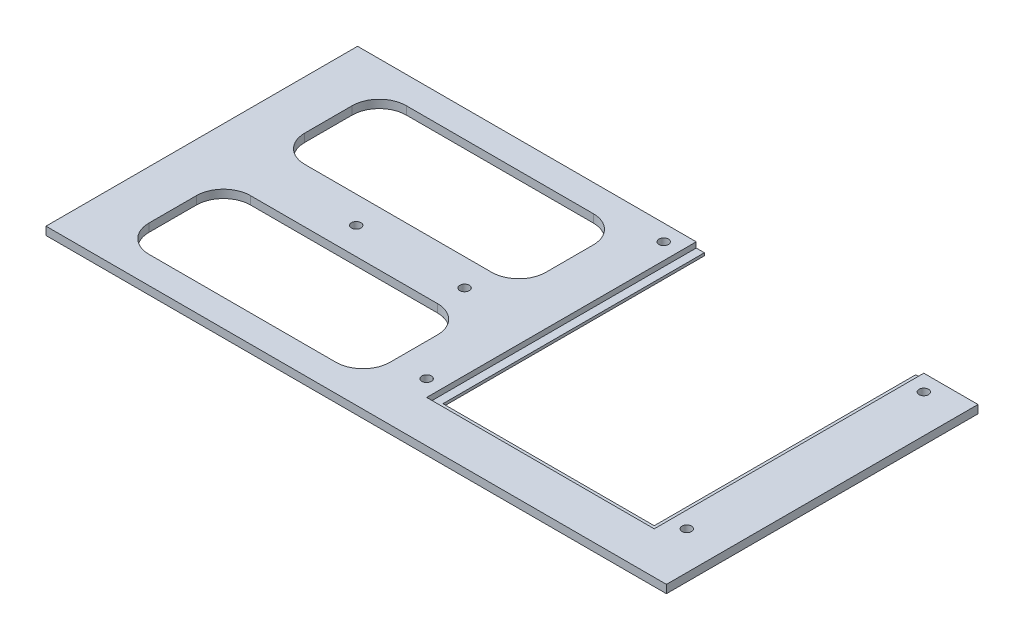
ISO-10303-21;
HEADER;
FILE_DESCRIPTION(('STEP AP214'),'2;1');
FILE_NAME('part.step','',(''),(''),'','','');
FILE_SCHEMA(('AUTOMOTIVE_DESIGN { 1 0 10303 214 1 1 1 1 }'));
ENDSEC;
DATA;
#1=APPLICATION_CONTEXT('core data for automotive mechanical design processes');
#2=APPLICATION_PROTOCOL_DEFINITION('international standard','automotive_design',2000,#1);
#3=PRODUCT_CONTEXT('',#1,'mechanical');
#4=PRODUCT('Part','Part','',(#3));
#5=PRODUCT_RELATED_PRODUCT_CATEGORY('part','',(#4));
#6=PRODUCT_DEFINITION_FORMATION('','',#4);
#7=PRODUCT_DEFINITION_CONTEXT('part definition',#1,'design');
#8=PRODUCT_DEFINITION('design','',#6,#7);
#9=PRODUCT_DEFINITION_SHAPE('','',#8);
#10=(LENGTH_UNIT() NAMED_UNIT(*) SI_UNIT(.MILLI.,.METRE.));
#11=(NAMED_UNIT(*) PLANE_ANGLE_UNIT() SI_UNIT($,.RADIAN.));
#12=(NAMED_UNIT(*) SI_UNIT($,.STERADIAN.) SOLID_ANGLE_UNIT());
#13=UNCERTAINTY_MEASURE_WITH_UNIT(LENGTH_MEASURE(1.E-05),#10,'distance_accuracy_value','');
#14=(GEOMETRIC_REPRESENTATION_CONTEXT(3) GLOBAL_UNCERTAINTY_ASSIGNED_CONTEXT((#13)) GLOBAL_UNIT_ASSIGNED_CONTEXT((#10,
#11,#12)) REPRESENTATION_CONTEXT('',''));
#15=CARTESIAN_POINT('',(0.,0.,0.));
#16=DIRECTION('',(0.,0.,1.));
#17=DIRECTION('',(1.,0.,0.));
#18=AXIS2_PLACEMENT_3D('',#15,#16,#17);
#19=CARTESIAN_POINT('',(-121.684913217623,3.,-60.5367156208277));
#20=DIRECTION('',(0.,0.,1.));
#21=DIRECTION('',(1.,0.,0.));
#22=AXIS2_PLACEMENT_3D('',#19,#20,#21);
#23=PLANE('',#22);
#24=DIRECTION('',(-1.,0.,0.));
#25=VECTOR('',#24,1.);
#26=CARTESIAN_POINT('',(0.,1.,-60.5367156208277));
#27=LINE('',#26,#25);
#28=CARTESIAN_POINT('',(6.31508678237656,1.,-60.5367156208277));
#29=VERTEX_POINT('',#28);
#30=CARTESIAN_POINT('',(3.31508678237656,1.,-60.5367156208277));
#31=VERTEX_POINT('',#30);
#32=EDGE_CURVE('E480',#29,#31,#27,.T.);
#33=ORIENTED_EDGE('',*,*,#32,.F.);
#34=DIRECTION('',(0.,1.,0.));
#35=VECTOR('',#34,1.);
#36=CARTESIAN_POINT('',(6.31508678237656,-1.,-60.5367156208277));
#37=LINE('',#36,#35);
#38=CARTESIAN_POINT('',(6.31508678237656,0.,-60.5367156208277));
#39=VERTEX_POINT('',#38);
#40=EDGE_CURVE('E445',#39,#29,#37,.T.);
#41=ORIENTED_EDGE('',*,*,#40,.F.);
#42=DIRECTION('',(-1.,0.,0.));
#43=VECTOR('',#42,1.);
#44=CARTESIAN_POINT('',(-121.684913217623,0.,-60.5367156208277));
#45=LINE('',#44,#43);
#46=CARTESIAN_POINT('',(-121.684913217623,0.,-60.5367156208277));
#47=VERTEX_POINT('',#46);
#48=EDGE_CURVE('E538',#39,#47,#45,.T.);
#49=ORIENTED_EDGE('',*,*,#48,.T.);
#50=DIRECTION('',(0.,-1.,0.));
#51=VECTOR('',#50,1.);
#52=CARTESIAN_POINT('',(-121.684913217623,3.,-60.5367156208277));
#53=LINE('',#52,#51);
#54=CARTESIAN_POINT('',(-121.684913217623,3.,-60.5367156208277));
#55=VERTEX_POINT('',#54);
#56=EDGE_CURVE('E528',#55,#47,#53,.T.);
#57=ORIENTED_EDGE('',*,*,#56,.F.);
#58=DIRECTION('',(-1.,0.,0.));
#59=VECTOR('',#58,1.);
#60=CARTESIAN_POINT('',(-121.684913217623,3.,-60.5367156208277));
#61=LINE('',#60,#59);
#62=CARTESIAN_POINT('',(3.31508678237656,3.,-60.5367156208277));
#63=VERTEX_POINT('',#62);
#64=EDGE_CURVE('E523',#63,#55,#61,.T.);
#65=ORIENTED_EDGE('',*,*,#64,.F.);
#66=DIRECTION('',(0.,1.,0.));
#67=VECTOR('',#66,1.);
#68=CARTESIAN_POINT('',(3.31508678237656,1.,-60.5367156208277));
#69=LINE('',#68,#67);
#70=EDGE_CURVE('E502',#31,#63,#69,.T.);
#71=ORIENTED_EDGE('',*,*,#70,.F.);
#72=EDGE_LOOP('',(#33,#41,#49,#57,#65,#71));
#73=FACE_BOUND('',#72,.T.);
#74=ADVANCED_FACE('F39',(#73),#23,.F.);
#75=CARTESIAN_POINT('',(107.315086782377,0.,-60.5367156208277));
#76=VERTEX_POINT('',#75);
#77=CARTESIAN_POINT('',(84.3150867823766,0.,-60.5367156208277));
#78=VERTEX_POINT('',#77);
#79=EDGE_CURVE('E517',#76,#78,#45,.T.);
#80=ORIENTED_EDGE('',*,*,#79,.T.);
#81=DIRECTION('',(0.,1.,0.));
#82=VECTOR('',#81,1.);
#83=CARTESIAN_POINT('',(84.3150867823766,-1.,-60.5367156208277));
#84=LINE('',#83,#82);
#85=CARTESIAN_POINT('',(84.3150867823766,1.,-60.5367156208277));
#86=VERTEX_POINT('',#85);
#87=EDGE_CURVE('E449',#78,#86,#84,.T.);
#88=ORIENTED_EDGE('',*,*,#87,.T.);
#89=CARTESIAN_POINT('',(87.3150867823766,1.,-60.5367156208277));
#90=VERTEX_POINT('',#89);
#91=EDGE_CURVE('E481',#90,#86,#27,.T.);
#92=ORIENTED_EDGE('',*,*,#91,.F.);
#93=DIRECTION('',(0.,1.,0.));
#94=VECTOR('',#93,1.);
#95=CARTESIAN_POINT('',(87.3150867823766,1.,-60.5367156208277));
#96=LINE('',#95,#94);
#97=CARTESIAN_POINT('',(87.3150867823766,3.,-60.5367156208277));
#98=VERTEX_POINT('',#97);
#99=EDGE_CURVE('E505',#90,#98,#96,.T.);
#100=ORIENTED_EDGE('',*,*,#99,.T.);
#101=CARTESIAN_POINT('',(107.315086782377,3.,-60.5367156208277));
#102=VERTEX_POINT('',#101);
#103=EDGE_CURVE('E524',#102,#98,#61,.T.);
#104=ORIENTED_EDGE('',*,*,#103,.F.);
#105=DIRECTION('',(0.,-1.,0.));
#106=VECTOR('',#105,1.);
#107=CARTESIAN_POINT('',(107.315086782377,3.,-60.5367156208277));
#108=LINE('',#107,#106);
#109=EDGE_CURVE('E545',#102,#76,#108,.T.);
#110=ORIENTED_EDGE('',*,*,#109,.T.);
#111=EDGE_LOOP('',(#80,#88,#92,#100,#104,#110));
#112=FACE_BOUND('',#111,.T.);
#113=ADVANCED_FACE('F562',(#112),#23,.F.);
#114=CARTESIAN_POINT('',(0.,3.,0.));
#115=DIRECTION('',(0.,1.,0.));
#116=DIRECTION('',(0.,0.,1.));
#117=AXIS2_PLACEMENT_3D('',#114,#115,#116);
#118=PLANE('',#117);
#119=CARTESIAN_POINT('',(-2.68491321762344,3.,-54.5367156208277));
#120=DIRECTION('',(0.,1.,0.));
#121=DIRECTION('',(0.,0.,1.));
#122=AXIS2_PLACEMENT_3D('',#119,#120,#121);
#123=CIRCLE('',#122,1.75);
#124=CARTESIAN_POINT('',(-2.68491321762344,3.,-52.7867156208277));
#125=VERTEX_POINT('',#124);
#126=EDGE_CURVE('E327',#125,#125,#123,.T.);
#127=ORIENTED_EDGE('',*,*,#126,.F.);
#128=EDGE_LOOP('',(#127));
#129=FACE_BOUND('',#128,.T.);
#130=CARTESIAN_POINT('',(-24.6849132176234,3.,16.9632843791723));
#131=DIRECTION('',(0.,1.,0.));
#132=DIRECTION('',(0.,0.,-1.));
#133=AXIS2_PLACEMENT_3D('',#130,#131,#132);
#134=CIRCLE('',#133,10.);
#135=CARTESIAN_POINT('',(-14.6849132176234,3.,16.9632843791723));
#136=VERTEX_POINT('',#135);
#137=CARTESIAN_POINT('',(-24.6849132176234,3.,6.96328437917233));
#138=VERTEX_POINT('',#137);
#139=EDGE_CURVE('E55',#136,#138,#134,.T.);
#140=ORIENTED_EDGE('',*,*,#139,.F.);
#141=DIRECTION('',(0.,0.,-1.));
#142=VECTOR('',#141,1.);
#143=CARTESIAN_POINT('',(-14.6849132176234,3.,16.9632843791723));
#144=LINE('',#143,#142);
#145=CARTESIAN_POINT('',(-14.6849132176234,3.,34.4632843791723));
#146=VERTEX_POINT('',#145);
#147=EDGE_CURVE('E250',#146,#136,#144,.T.);
#148=ORIENTED_EDGE('',*,*,#147,.F.);
#149=CARTESIAN_POINT('',(-24.6849132176234,3.,34.4632843791723));
#150=DIRECTION('',(0.,1.,0.));
#151=DIRECTION('',(0.,0.,-1.));
#152=AXIS2_PLACEMENT_3D('',#149,#150,#151);
#153=CIRCLE('',#152,10.);
#154=CARTESIAN_POINT('',(-24.6849132176234,3.,44.4632843791723));
#155=VERTEX_POINT('',#154);
#156=EDGE_CURVE('E254',#155,#146,#153,.T.);
#157=ORIENTED_EDGE('',*,*,#156,.F.);
#158=DIRECTION('',(1.,0.,0.));
#159=VECTOR('',#158,1.);
#160=CARTESIAN_POINT('',(-93.6849132176235,3.,44.4632843791723));
#161=LINE('',#160,#159);
#162=CARTESIAN_POINT('',(-93.6849132176235,3.,44.4632843791723));
#163=VERTEX_POINT('',#162);
#164=EDGE_CURVE('E297',#163,#155,#161,.T.);
#165=ORIENTED_EDGE('',*,*,#164,.F.);
#166=CARTESIAN_POINT('',(-93.6849132176235,3.,34.4632843791723));
#167=DIRECTION('',(0.,1.,0.));
#168=DIRECTION('',(0.,0.,-1.));
#169=AXIS2_PLACEMENT_3D('',#166,#167,#168);
#170=CIRCLE('',#169,10.);
#171=CARTESIAN_POINT('',(-103.684913217623,3.,34.4632843791723));
#172=VERTEX_POINT('',#171);
#173=EDGE_CURVE('E293',#172,#163,#170,.T.);
#174=ORIENTED_EDGE('',*,*,#173,.F.);
#175=DIRECTION('',(0.,0.,1.));
#176=VECTOR('',#175,1.);
#177=CARTESIAN_POINT('',(-103.684913217623,3.,16.9632843791723));
#178=LINE('',#177,#176);
#179=CARTESIAN_POINT('',(-103.684913217623,3.,16.9632843791723));
#180=VERTEX_POINT('',#179);
#181=EDGE_CURVE('E289',#180,#172,#178,.T.);
#182=ORIENTED_EDGE('',*,*,#181,.F.);
#183=CARTESIAN_POINT('',(-93.6849132176235,3.,16.9632843791723));
#184=DIRECTION('',(0.,1.,0.));
#185=DIRECTION('',(0.,0.,-1.));
#186=AXIS2_PLACEMENT_3D('',#183,#184,#185);
#187=CIRCLE('',#186,9.99999999999999);
#188=CARTESIAN_POINT('',(-93.6849132176235,3.,6.96328437917233));
#189=VERTEX_POINT('',#188);
#190=EDGE_CURVE('E285',#189,#180,#187,.T.);
#191=ORIENTED_EDGE('',*,*,#190,.F.);
#192=DIRECTION('',(-1.,0.,0.));
#193=VECTOR('',#192,1.);
#194=CARTESIAN_POINT('',(-93.6849132176235,3.,6.96328437917233));
#195=LINE('',#194,#193);
#196=EDGE_CURVE('E281',#138,#189,#195,.T.);
#197=ORIENTED_EDGE('',*,*,#196,.F.);
#198=EDGE_LOOP('',(#140,#148,#157,#165,#174,#182,#191,#197));
#199=FACE_BOUND('',#198,.T.);
#200=CARTESIAN_POINT('',(-24.6849132176234,3.,-40.5367156208277));
#201=DIRECTION('',(0.,1.,0.));
#202=DIRECTION('',(0.,0.,-1.));
#203=AXIS2_PLACEMENT_3D('',#200,#201,#202);
#204=CIRCLE('',#203,10.);
#205=CARTESIAN_POINT('',(-14.6849132176234,3.,-40.5367156208277));
#206=VERTEX_POINT('',#205);
#207=CARTESIAN_POINT('',(-24.6849132176234,3.,-50.5367156208277));
#208=VERTEX_POINT('',#207);
#209=EDGE_CURVE('E63',#206,#208,#204,.T.);
#210=ORIENTED_EDGE('',*,*,#209,.F.);
#211=DIRECTION('',(0.,0.,-1.));
#212=VECTOR('',#211,1.);
#213=CARTESIAN_POINT('',(-14.6849132176234,3.,-40.5367156208277));
#214=LINE('',#213,#212);
#215=CARTESIAN_POINT('',(-14.6849132176234,3.,-23.0367156208277));
#216=VERTEX_POINT('',#215);
#217=EDGE_CURVE('E347',#216,#206,#214,.T.);
#218=ORIENTED_EDGE('',*,*,#217,.F.);
#219=CARTESIAN_POINT('',(-24.6849132176234,3.,-23.0367156208277));
#220=DIRECTION('',(0.,1.,0.));
#221=DIRECTION('',(0.,0.,-1.));
#222=AXIS2_PLACEMENT_3D('',#219,#220,#221);
#223=CIRCLE('',#222,10.);
#224=CARTESIAN_POINT('',(-24.6849132176234,3.,-13.0367156208277));
#225=VERTEX_POINT('',#224);
#226=EDGE_CURVE('E398',#225,#216,#223,.T.);
#227=ORIENTED_EDGE('',*,*,#226,.F.);
#228=DIRECTION('',(1.,0.,0.));
#229=VECTOR('',#228,1.);
#230=CARTESIAN_POINT('',(-93.6849132176235,3.,-13.0367156208277));
#231=LINE('',#230,#229);
#232=CARTESIAN_POINT('',(-93.6849132176235,3.,-13.0367156208277));
#233=VERTEX_POINT('',#232);
#234=EDGE_CURVE('E394',#233,#225,#231,.T.);
#235=ORIENTED_EDGE('',*,*,#234,.F.);
#236=CARTESIAN_POINT('',(-93.6849132176235,3.,-23.0367156208277));
#237=DIRECTION('',(0.,1.,0.));
#238=DIRECTION('',(0.,0.,-1.));
#239=AXIS2_PLACEMENT_3D('',#236,#237,#238);
#240=CIRCLE('',#239,9.99999999999999);
#241=CARTESIAN_POINT('',(-103.684913217623,3.,-23.0367156208277));
#242=VERTEX_POINT('',#241);
#243=EDGE_CURVE('E390',#242,#233,#240,.T.);
#244=ORIENTED_EDGE('',*,*,#243,.F.);
#245=DIRECTION('',(0.,0.,1.));
#246=VECTOR('',#245,1.);
#247=CARTESIAN_POINT('',(-103.684913217623,3.,-40.5367156208277));
#248=LINE('',#247,#246);
#249=CARTESIAN_POINT('',(-103.684913217623,3.,-40.5367156208277));
#250=VERTEX_POINT('',#249);
#251=EDGE_CURVE('E386',#250,#242,#248,.T.);
#252=ORIENTED_EDGE('',*,*,#251,.F.);
#253=CARTESIAN_POINT('',(-93.6849132176235,3.,-40.5367156208277));
#254=DIRECTION('',(0.,1.,0.));
#255=DIRECTION('',(0.,0.,-1.));
#256=AXIS2_PLACEMENT_3D('',#253,#254,#255);
#257=CIRCLE('',#256,10.);
#258=CARTESIAN_POINT('',(-93.6849132176235,3.,-50.5367156208277));
#259=VERTEX_POINT('',#258);
#260=EDGE_CURVE('E382',#259,#250,#257,.T.);
#261=ORIENTED_EDGE('',*,*,#260,.F.);
#262=DIRECTION('',(-1.,0.,0.));
#263=VECTOR('',#262,1.);
#264=CARTESIAN_POINT('',(-93.6849132176235,3.,-50.5367156208277));
#265=LINE('',#264,#263);
#266=EDGE_CURVE('E378',#208,#259,#265,.T.);
#267=ORIENTED_EDGE('',*,*,#266,.F.);
#268=EDGE_LOOP('',(#210,#218,#227,#235,#244,#252,#261,#267));
#269=FACE_BOUND('',#268,.T.);
#270=CARTESIAN_POINT('',(-24.6849132176234,3.,-3.03671562082767));
#271=DIRECTION('',(0.,1.,0.));
#272=DIRECTION('',(0.,0.,1.));
#273=AXIS2_PLACEMENT_3D('',#270,#271,#272);
#274=CIRCLE('',#273,1.75);
#275=CARTESIAN_POINT('',(-24.6849132176234,3.,-1.28671562082767));
#276=VERTEX_POINT('',#275);
#277=EDGE_CURVE('E337',#276,#276,#274,.T.);
#278=ORIENTED_EDGE('',*,*,#277,.F.);
#279=EDGE_LOOP('',(#278));
#280=FACE_BOUND('',#279,.T.);
#281=CARTESIAN_POINT('',(93.3150867823766,3.,-54.5367156208277));
#282=DIRECTION('',(0.,1.,0.));
#283=DIRECTION('',(0.,0.,1.));
#284=AXIS2_PLACEMENT_3D('',#281,#282,#283);
#285=CIRCLE('',#284,1.75);
#286=CARTESIAN_POINT('',(93.3150867823766,3.,-52.7867156208277));
#287=VERTEX_POINT('',#286);
#288=EDGE_CURVE('E927',#287,#287,#285,.T.);
#289=ORIENTED_EDGE('',*,*,#288,.F.);
#290=EDGE_LOOP('',(#289));
#291=FACE_BOUND('',#290,.T.);
#292=CARTESIAN_POINT('',(93.3150867823766,3.,32.9632843791723));
#293=DIRECTION('',(0.,1.,0.));
#294=DIRECTION('',(0.,0.,1.));
#295=AXIS2_PLACEMENT_3D('',#292,#293,#294);
#296=CIRCLE('',#295,1.75);
#297=CARTESIAN_POINT('',(93.3150867823766,3.,34.7132843791723));
#298=VERTEX_POINT('',#297);
#299=EDGE_CURVE('E931',#298,#298,#296,.T.);
#300=ORIENTED_EDGE('',*,*,#299,.F.);
#301=EDGE_LOOP('',(#300));
#302=FACE_BOUND('',#301,.T.);
#303=CARTESIAN_POINT('',(-2.68491321762344,3.,32.9632843791723));
#304=DIRECTION('',(0.,1.,0.));
#305=DIRECTION('',(0.,0.,1.));
#306=AXIS2_PLACEMENT_3D('',#303,#304,#305);
#307=CIRCLE('',#306,1.75);
#308=CARTESIAN_POINT('',(-2.68491321762344,3.,34.7132843791723));
#309=VERTEX_POINT('',#308);
#310=EDGE_CURVE('E257',#309,#309,#307,.T.);
#311=ORIENTED_EDGE('',*,*,#310,.F.);
#312=EDGE_LOOP('',(#311));
#313=FACE_BOUND('',#312,.T.);
#314=CARTESIAN_POINT('',(-64.6849132176235,3.,-3.03671562082767));
#315=DIRECTION('',(0.,1.,0.));
#316=DIRECTION('',(0.,0.,1.));
#317=AXIS2_PLACEMENT_3D('',#314,#315,#316);
#318=CIRCLE('',#317,1.75);
#319=CARTESIAN_POINT('',(-64.6849132176235,3.,-1.28671562082767));
#320=VERTEX_POINT('',#319);
#321=EDGE_CURVE('E336',#320,#320,#318,.T.);
#322=ORIENTED_EDGE('',*,*,#321,.F.);
#323=EDGE_LOOP('',(#322));
#324=FACE_BOUND('',#323,.T.);
#325=DIRECTION('',(1.,0.,0.));
#326=VECTOR('',#325,1.);
#327=CARTESIAN_POINT('',(0.,3.,38.9632843791723));
#328=LINE('',#327,#326);
#329=CARTESIAN_POINT('',(3.31508678237656,3.,38.9632843791723));
#330=VERTEX_POINT('',#329);
#331=CARTESIAN_POINT('',(87.3150867823766,3.,38.9632843791723));
#332=VERTEX_POINT('',#331);
#333=EDGE_CURVE('E470',#330,#332,#328,.T.);
#334=ORIENTED_EDGE('',*,*,#333,.F.);
#335=DIRECTION('',(0.,0.,-1.));
#336=VECTOR('',#335,1.);
#337=CARTESIAN_POINT('',(3.31508678237656,3.,0.));
#338=LINE('',#337,#336);
#339=EDGE_CURVE('E476',#330,#63,#338,.T.);
#340=ORIENTED_EDGE('',*,*,#339,.T.);
#341=ORIENTED_EDGE('',*,*,#64,.T.);
#342=DIRECTION('',(0.,0.,1.));
#343=VECTOR('',#342,1.);
#344=CARTESIAN_POINT('',(-121.684913217623,3.,-60.5367156208277));
#345=LINE('',#344,#343);
#346=CARTESIAN_POINT('',(-121.684913217623,3.,54.4632843791723));
#347=VERTEX_POINT('',#346);
#348=EDGE_CURVE('E512',#55,#347,#345,.T.);
#349=ORIENTED_EDGE('',*,*,#348,.T.);
#350=DIRECTION('',(1.,0.,0.));
#351=VECTOR('',#350,1.);
#352=CARTESIAN_POINT('',(-121.684913217623,3.,54.4632843791723));
#353=LINE('',#352,#351);
#354=CARTESIAN_POINT('',(107.315086782377,3.,54.4632843791723));
#355=VERTEX_POINT('',#354);
#356=EDGE_CURVE('E516',#347,#355,#353,.T.);
#357=ORIENTED_EDGE('',*,*,#356,.T.);
#358=DIRECTION('',(0.,0.,-1.));
#359=VECTOR('',#358,1.);
#360=CARTESIAN_POINT('',(107.315086782377,3.,-60.5367156208277));
#361=LINE('',#360,#359);
#362=EDGE_CURVE('E520',#355,#102,#361,.T.);
#363=ORIENTED_EDGE('',*,*,#362,.T.);
#364=ORIENTED_EDGE('',*,*,#103,.T.);
#365=DIRECTION('',(0.,0.,-1.));
#366=VECTOR('',#365,1.);
#367=CARTESIAN_POINT('',(87.3150867823766,3.,0.));
#368=LINE('',#367,#366);
#369=EDGE_CURVE('E492',#332,#98,#368,.T.);
#370=ORIENTED_EDGE('',*,*,#369,.F.);
#371=EDGE_LOOP('',(#334,#340,#341,#349,#357,#363,#364,#370));
#372=FACE_BOUND('',#371,.T.);
#373=ADVANCED_FACE('F568',(#129,#199,#269,#280,#291,#302,#313,#324,#372),#118,.T.);
#374=CARTESIAN_POINT('',(-121.684913217623,3.,-60.5367156208277));
#375=DIRECTION('',(1.,0.,0.));
#376=DIRECTION('',(0.,0.,-1.));
#377=AXIS2_PLACEMENT_3D('',#374,#375,#376);
#378=PLANE('',#377);
#379=DIRECTION('',(0.,0.,1.));
#380=VECTOR('',#379,1.);
#381=CARTESIAN_POINT('',(-121.684913217623,0.,-60.5367156208277));
#382=LINE('',#381,#380);
#383=CARTESIAN_POINT('',(-121.684913217623,0.,54.4632843791723));
#384=VERTEX_POINT('',#383);
#385=EDGE_CURVE('E501',#47,#384,#382,.T.);
#386=ORIENTED_EDGE('',*,*,#385,.T.);
#387=DIRECTION('',(0.,-1.,0.));
#388=VECTOR('',#387,1.);
#389=CARTESIAN_POINT('',(-121.684913217623,3.,54.4632843791723));
#390=LINE('',#389,#388);
#391=EDGE_CURVE('E11',#347,#384,#390,.T.);
#392=ORIENTED_EDGE('',*,*,#391,.F.);
#393=ORIENTED_EDGE('',*,*,#348,.F.);
#394=ORIENTED_EDGE('',*,*,#56,.T.);
#395=EDGE_LOOP('',(#386,#392,#393,#394));
#396=FACE_BOUND('',#395,.T.);
#397=ADVANCED_FACE('F41',(#396),#378,.F.);
#398=CARTESIAN_POINT('',(-121.684913217623,3.,54.4632843791723));
#399=DIRECTION('',(0.,0.,-1.));
#400=DIRECTION('',(-1.,0.,0.));
#401=AXIS2_PLACEMENT_3D('',#398,#399,#400);
#402=PLANE('',#401);
#403=DIRECTION('',(1.,0.,0.));
#404=VECTOR('',#403,1.);
#405=CARTESIAN_POINT('',(-121.684913217623,0.,54.4632843791723));
#406=LINE('',#405,#404);
#407=CARTESIAN_POINT('',(107.315086782377,0.,54.4632843791723));
#408=VERTEX_POINT('',#407);
#409=EDGE_CURVE('E532',#384,#408,#406,.T.);
#410=ORIENTED_EDGE('',*,*,#409,.T.);
#411=DIRECTION('',(0.,-1.,0.));
#412=VECTOR('',#411,1.);
#413=CARTESIAN_POINT('',(107.315086782377,3.,54.4632843791723));
#414=LINE('',#413,#412);
#415=EDGE_CURVE('E48',#355,#408,#414,.T.);
#416=ORIENTED_EDGE('',*,*,#415,.F.);
#417=ORIENTED_EDGE('',*,*,#356,.F.);
#418=ORIENTED_EDGE('',*,*,#391,.T.);
#419=EDGE_LOOP('',(#410,#416,#417,#418));
#420=FACE_BOUND('',#419,.T.);
#421=ADVANCED_FACE('F571',(#420),#402,.F.);
#422=CARTESIAN_POINT('',(107.315086782377,3.,-60.5367156208277));
#423=DIRECTION('',(-1.,0.,0.));
#424=DIRECTION('',(0.,0.,1.));
#425=AXIS2_PLACEMENT_3D('',#422,#423,#424);
#426=PLANE('',#425);
#427=DIRECTION('',(0.,0.,-1.));
#428=VECTOR('',#427,1.);
#429=CARTESIAN_POINT('',(107.315086782377,0.,-60.5367156208277));
#430=LINE('',#429,#428);
#431=EDGE_CURVE('E535',#408,#76,#430,.T.);
#432=ORIENTED_EDGE('',*,*,#431,.T.);
#433=ORIENTED_EDGE('',*,*,#109,.F.);
#434=ORIENTED_EDGE('',*,*,#362,.F.);
#435=ORIENTED_EDGE('',*,*,#415,.T.);
#436=EDGE_LOOP('',(#432,#433,#434,#435));
#437=FACE_BOUND('',#436,.T.);
#438=ADVANCED_FACE('F554',(#437),#426,.F.);
#439=CARTESIAN_POINT('',(0.,0.,0.));
#440=DIRECTION('',(0.,1.,0.));
#441=DIRECTION('',(0.,0.,1.));
#442=AXIS2_PLACEMENT_3D('',#439,#440,#441);
#443=PLANE('',#442);
#444=CARTESIAN_POINT('',(-2.68491321762344,0.,-54.5367156208277));
#445=DIRECTION('',(0.,1.,0.));
#446=DIRECTION('',(0.,0.,1.));
#447=AXIS2_PLACEMENT_3D('',#444,#445,#446);
#448=CIRCLE('',#447,1.75);
#449=CARTESIAN_POINT('',(-2.68491321762344,0.,-52.7867156208277));
#450=VERTEX_POINT('',#449);
#451=EDGE_CURVE('E282',#450,#450,#448,.T.);
#452=ORIENTED_EDGE('',*,*,#451,.T.);
#453=EDGE_LOOP('',(#452));
#454=FACE_BOUND('',#453,.T.);
#455=DIRECTION('',(0.,0.,-1.));
#456=VECTOR('',#455,1.);
#457=CARTESIAN_POINT('',(-14.6849132176234,0.,16.9632843791723));
#458=LINE('',#457,#456);
#459=CARTESIAN_POINT('',(-14.6849132176234,0.,34.4632843791723));
#460=VERTEX_POINT('',#459);
#461=CARTESIAN_POINT('',(-14.6849132176234,0.,16.9632843791723));
#462=VERTEX_POINT('',#461);
#463=EDGE_CURVE('E234',#460,#462,#458,.T.);
#464=ORIENTED_EDGE('',*,*,#463,.T.);
#465=CARTESIAN_POINT('',(-24.6849132176234,0.,16.9632843791723));
#466=DIRECTION('',(0.,1.,0.));
#467=DIRECTION('',(0.,0.,-1.));
#468=AXIS2_PLACEMENT_3D('',#465,#466,#467);
#469=CIRCLE('',#468,10.);
#470=CARTESIAN_POINT('',(-24.6849132176234,0.,6.96328437917233));
#471=VERTEX_POINT('',#470);
#472=EDGE_CURVE('E227',#462,#471,#469,.T.);
#473=ORIENTED_EDGE('',*,*,#472,.T.);
#474=DIRECTION('',(-1.,0.,0.));
#475=VECTOR('',#474,1.);
#476=CARTESIAN_POINT('',(-93.6849132176235,0.,6.96328437917233));
#477=LINE('',#476,#475);
#478=CARTESIAN_POINT('',(-93.6849132176235,0.,6.96328437917233));
#479=VERTEX_POINT('',#478);
#480=EDGE_CURVE('E238',#471,#479,#477,.T.);
#481=ORIENTED_EDGE('',*,*,#480,.T.);
#482=CARTESIAN_POINT('',(-93.6849132176235,0.,16.9632843791723));
#483=DIRECTION('',(0.,1.,0.));
#484=DIRECTION('',(0.,0.,-1.));
#485=AXIS2_PLACEMENT_3D('',#482,#483,#484);
#486=CIRCLE('',#485,9.99999999999999);
#487=CARTESIAN_POINT('',(-103.684913217623,0.,16.9632843791723));
#488=VERTEX_POINT('',#487);
#489=EDGE_CURVE('E243',#479,#488,#486,.T.);
#490=ORIENTED_EDGE('',*,*,#489,.T.);
#491=DIRECTION('',(0.,0.,1.));
#492=VECTOR('',#491,1.);
#493=CARTESIAN_POINT('',(-103.684913217623,0.,16.9632843791723));
#494=LINE('',#493,#492);
#495=CARTESIAN_POINT('',(-103.684913217623,0.,34.4632843791723));
#496=VERTEX_POINT('',#495);
#497=EDGE_CURVE('E262',#488,#496,#494,.T.);
#498=ORIENTED_EDGE('',*,*,#497,.T.);
#499=CARTESIAN_POINT('',(-93.6849132176235,0.,34.4632843791723));
#500=DIRECTION('',(0.,1.,0.));
#501=DIRECTION('',(0.,0.,-1.));
#502=AXIS2_PLACEMENT_3D('',#499,#500,#501);
#503=CIRCLE('',#502,10.);
#504=CARTESIAN_POINT('',(-93.6849132176235,0.,44.4632843791723));
#505=VERTEX_POINT('',#504);
#506=EDGE_CURVE('E266',#496,#505,#503,.T.);
#507=ORIENTED_EDGE('',*,*,#506,.T.);
#508=DIRECTION('',(1.,0.,0.));
#509=VECTOR('',#508,1.);
#510=CARTESIAN_POINT('',(-93.6849132176235,0.,44.4632843791723));
#511=LINE('',#510,#509);
#512=CARTESIAN_POINT('',(-24.6849132176234,0.,44.4632843791723));
#513=VERTEX_POINT('',#512);
#514=EDGE_CURVE('E270',#505,#513,#511,.T.);
#515=ORIENTED_EDGE('',*,*,#514,.T.);
#516=CARTESIAN_POINT('',(-24.6849132176234,0.,34.4632843791723));
#517=DIRECTION('',(0.,1.,0.));
#518=DIRECTION('',(0.,0.,-1.));
#519=AXIS2_PLACEMENT_3D('',#516,#517,#518);
#520=CIRCLE('',#519,10.);
#521=EDGE_CURVE('E274',#513,#460,#520,.T.);
#522=ORIENTED_EDGE('',*,*,#521,.T.);
#523=EDGE_LOOP('',(#464,#473,#481,#490,#498,#507,#515,#522));
#524=FACE_BOUND('',#523,.T.);
#525=DIRECTION('',(0.,0.,-1.));
#526=VECTOR('',#525,1.);
#527=CARTESIAN_POINT('',(-14.6849132176234,0.,-40.5367156208277));
#528=LINE('',#527,#526);
#529=CARTESIAN_POINT('',(-14.6849132176234,0.,-23.0367156208277));
#530=VERTEX_POINT('',#529);
#531=CARTESIAN_POINT('',(-14.6849132176234,0.,-40.5367156208277));
#532=VERTEX_POINT('',#531);
#533=EDGE_CURVE('E371',#530,#532,#528,.T.);
#534=ORIENTED_EDGE('',*,*,#533,.T.);
#535=CARTESIAN_POINT('',(-24.6849132176234,0.,-40.5367156208277));
#536=DIRECTION('',(0.,1.,0.));
#537=DIRECTION('',(0.,0.,-1.));
#538=AXIS2_PLACEMENT_3D('',#535,#536,#537);
#539=CIRCLE('',#538,10.);
#540=CARTESIAN_POINT('',(-24.6849132176234,0.,-50.5367156208277));
#541=VERTEX_POINT('',#540);
#542=EDGE_CURVE('E342',#532,#541,#539,.T.);
#543=ORIENTED_EDGE('',*,*,#542,.T.);
#544=DIRECTION('',(-1.,0.,0.));
#545=VECTOR('',#544,1.);
#546=CARTESIAN_POINT('',(-93.6849132176235,0.,-50.5367156208277));
#547=LINE('',#546,#545);
#548=CARTESIAN_POINT('',(-93.6849132176235,0.,-50.5367156208277));
#549=VERTEX_POINT('',#548);
#550=EDGE_CURVE('E346',#541,#549,#547,.T.);
#551=ORIENTED_EDGE('',*,*,#550,.T.);
#552=CARTESIAN_POINT('',(-93.6849132176235,0.,-40.5367156208277));
#553=DIRECTION('',(0.,1.,0.));
#554=DIRECTION('',(0.,0.,-1.));
#555=AXIS2_PLACEMENT_3D('',#552,#553,#554);
#556=CIRCLE('',#555,10.);
#557=CARTESIAN_POINT('',(-103.684913217623,0.,-40.5367156208277));
#558=VERTEX_POINT('',#557);
#559=EDGE_CURVE('E351',#549,#558,#556,.T.);
#560=ORIENTED_EDGE('',*,*,#559,.T.);
#561=DIRECTION('',(0.,0.,1.));
#562=VECTOR('',#561,1.);
#563=CARTESIAN_POINT('',(-103.684913217623,0.,-40.5367156208277));
#564=LINE('',#563,#562);
#565=CARTESIAN_POINT('',(-103.684913217623,0.,-23.0367156208277));
#566=VERTEX_POINT('',#565);
#567=EDGE_CURVE('E355',#558,#566,#564,.T.);
#568=ORIENTED_EDGE('',*,*,#567,.T.);
#569=CARTESIAN_POINT('',(-93.6849132176235,0.,-23.0367156208277));
#570=DIRECTION('',(0.,1.,0.));
#571=DIRECTION('',(0.,0.,-1.));
#572=AXIS2_PLACEMENT_3D('',#569,#570,#571);
#573=CIRCLE('',#572,9.99999999999999);
#574=CARTESIAN_POINT('',(-93.6849132176235,0.,-13.0367156208277));
#575=VERTEX_POINT('',#574);
#576=EDGE_CURVE('E359',#566,#575,#573,.T.);
#577=ORIENTED_EDGE('',*,*,#576,.T.);
#578=DIRECTION('',(1.,0.,0.));
#579=VECTOR('',#578,1.);
#580=CARTESIAN_POINT('',(-93.6849132176235,0.,-13.0367156208277));
#581=LINE('',#580,#579);
#582=CARTESIAN_POINT('',(-24.6849132176234,0.,-13.0367156208277));
#583=VERTEX_POINT('',#582);
#584=EDGE_CURVE('E363',#575,#583,#581,.T.);
#585=ORIENTED_EDGE('',*,*,#584,.T.);
#586=CARTESIAN_POINT('',(-24.6849132176234,0.,-23.0367156208277));
#587=DIRECTION('',(0.,1.,0.));
#588=DIRECTION('',(0.,0.,-1.));
#589=AXIS2_PLACEMENT_3D('',#586,#587,#588);
#590=CIRCLE('',#589,10.);
#591=EDGE_CURVE('E367',#583,#530,#590,.T.);
#592=ORIENTED_EDGE('',*,*,#591,.T.);
#593=EDGE_LOOP('',(#534,#543,#551,#560,#568,#577,#585,#592));
#594=FACE_BOUND('',#593,.T.);
#595=CARTESIAN_POINT('',(-24.6849132176234,0.,-3.03671562082767));
#596=DIRECTION('',(0.,1.,0.));
#597=DIRECTION('',(0.,0.,1.));
#598=AXIS2_PLACEMENT_3D('',#595,#596,#597);
#599=CIRCLE('',#598,1.75);
#600=CARTESIAN_POINT('',(-24.6849132176234,0.,-1.28671562082767));
#601=VERTEX_POINT('',#600);
#602=EDGE_CURVE('E332',#601,#601,#599,.T.);
#603=ORIENTED_EDGE('',*,*,#602,.T.);
#604=EDGE_LOOP('',(#603));
#605=FACE_BOUND('',#604,.T.);
#606=CARTESIAN_POINT('',(93.3150867823766,0.,-54.5367156208277));
#607=DIRECTION('',(0.,1.,0.));
#608=DIRECTION('',(0.,0.,1.));
#609=AXIS2_PLACEMENT_3D('',#606,#607,#608);
#610=CIRCLE('',#609,1.75);
#611=CARTESIAN_POINT('',(93.3150867823766,0.,-52.7867156208277));
#612=VERTEX_POINT('',#611);
#613=EDGE_CURVE('E331',#612,#612,#610,.T.);
#614=ORIENTED_EDGE('',*,*,#613,.T.);
#615=EDGE_LOOP('',(#614));
#616=FACE_BOUND('',#615,.T.);
#617=CARTESIAN_POINT('',(93.3150867823766,0.,32.9632843791723));
#618=DIRECTION('',(0.,1.,0.));
#619=DIRECTION('',(0.,0.,1.));
#620=AXIS2_PLACEMENT_3D('',#617,#618,#619);
#621=CIRCLE('',#620,1.75);
#622=CARTESIAN_POINT('',(93.3150867823766,0.,34.7132843791723));
#623=VERTEX_POINT('',#622);
#624=EDGE_CURVE('E945',#623,#623,#621,.T.);
#625=ORIENTED_EDGE('',*,*,#624,.T.);
#626=EDGE_LOOP('',(#625));
#627=FACE_BOUND('',#626,.T.);
#628=CARTESIAN_POINT('',(-2.68491321762344,0.,32.9632843791723));
#629=DIRECTION('',(0.,1.,0.));
#630=DIRECTION('',(0.,0.,1.));
#631=AXIS2_PLACEMENT_3D('',#628,#629,#630);
#632=CIRCLE('',#631,1.75);
#633=CARTESIAN_POINT('',(-2.68491321762344,0.,34.7132843791723));
#634=VERTEX_POINT('',#633);
#635=EDGE_CURVE('E939',#634,#634,#632,.T.);
#636=ORIENTED_EDGE('',*,*,#635,.T.);
#637=EDGE_LOOP('',(#636));
#638=FACE_BOUND('',#637,.T.);
#639=CARTESIAN_POINT('',(-64.6849132176235,0.,-3.03671562082767));
#640=DIRECTION('',(0.,1.,0.));
#641=DIRECTION('',(0.,0.,1.));
#642=AXIS2_PLACEMENT_3D('',#639,#640,#641);
#643=CIRCLE('',#642,1.75);
#644=CARTESIAN_POINT('',(-64.6849132176235,0.,-1.28671562082767));
#645=VERTEX_POINT('',#644);
#646=EDGE_CURVE('E427',#645,#645,#643,.T.);
#647=ORIENTED_EDGE('',*,*,#646,.T.);
#648=EDGE_LOOP('',(#647));
#649=FACE_BOUND('',#648,.T.);
#650=ORIENTED_EDGE('',*,*,#48,.F.);
#651=DIRECTION('',(0.,0.,1.));
#652=VECTOR('',#651,1.);
#653=CARTESIAN_POINT('',(6.31508678237657,0.,0.));
#654=LINE('',#653,#652);
#655=CARTESIAN_POINT('',(6.31508678237657,0.,35.9632843791723));
#656=VERTEX_POINT('',#655);
#657=EDGE_CURVE('E466',#39,#656,#654,.T.);
#658=ORIENTED_EDGE('',*,*,#657,.T.);
#659=DIRECTION('',(1.,0.,0.));
#660=VECTOR('',#659,1.);
#661=CARTESIAN_POINT('',(0.,0.,35.9632843791723));
#662=LINE('',#661,#660);
#663=CARTESIAN_POINT('',(84.3150867823766,0.,35.9632843791723));
#664=VERTEX_POINT('',#663);
#665=EDGE_CURVE('E448',#656,#664,#662,.T.);
#666=ORIENTED_EDGE('',*,*,#665,.T.);
#667=DIRECTION('',(0.,0.,-1.));
#668=VECTOR('',#667,1.);
#669=CARTESIAN_POINT('',(84.3150867823766,0.,0.));
#670=LINE('',#669,#668);
#671=EDGE_CURVE('E462',#664,#78,#670,.T.);
#672=ORIENTED_EDGE('',*,*,#671,.T.);
#673=ORIENTED_EDGE('',*,*,#79,.F.);
#674=ORIENTED_EDGE('',*,*,#431,.F.);
#675=ORIENTED_EDGE('',*,*,#409,.F.);
#676=ORIENTED_EDGE('',*,*,#385,.F.);
#677=EDGE_LOOP('',(#650,#658,#666,#672,#673,#674,#675,#676));
#678=FACE_BOUND('',#677,.T.);
#679=ADVANCED_FACE('F245',(#454,#524,#594,#605,#616,#627,#638,#649,#678),#443,.F.);
#680=CARTESIAN_POINT('',(0.,1.,38.9632843791723));
#681=DIRECTION('',(0.,0.,1.));
#682=DIRECTION('',(1.,0.,0.));
#683=AXIS2_PLACEMENT_3D('',#680,#681,#682);
#684=PLANE('',#683);
#685=ORIENTED_EDGE('',*,*,#333,.T.);
#686=DIRECTION('',(0.,1.,0.));
#687=VECTOR('',#686,1.);
#688=CARTESIAN_POINT('',(87.3150867823766,1.,38.9632843791723));
#689=LINE('',#688,#687);
#690=CARTESIAN_POINT('',(87.3150867823766,1.,38.9632843791723));
#691=VERTEX_POINT('',#690);
#692=EDGE_CURVE('E489',#691,#332,#689,.T.);
#693=ORIENTED_EDGE('',*,*,#692,.F.);
#694=DIRECTION('',(1.,0.,0.));
#695=VECTOR('',#694,1.);
#696=CARTESIAN_POINT('',(0.,1.,38.9632843791723));
#697=LINE('',#696,#695);
#698=CARTESIAN_POINT('',(3.31508678237656,1.,38.9632843791723));
#699=VERTEX_POINT('',#698);
#700=EDGE_CURVE('E471',#699,#691,#697,.T.);
#701=ORIENTED_EDGE('',*,*,#700,.F.);
#702=DIRECTION('',(0.,1.,0.));
#703=VECTOR('',#702,1.);
#704=CARTESIAN_POINT('',(3.31508678237656,1.,38.9632843791723));
#705=LINE('',#704,#703);
#706=EDGE_CURVE('E498',#699,#330,#705,.T.);
#707=ORIENTED_EDGE('',*,*,#706,.T.);
#708=EDGE_LOOP('',(#685,#693,#701,#707));
#709=FACE_BOUND('',#708,.T.);
#710=ADVANCED_FACE('F592',(#709),#684,.F.);
#711=CARTESIAN_POINT('',(3.31508678237656,1.,0.));
#712=DIRECTION('',(1.,0.,0.));
#713=DIRECTION('',(0.,0.,-1.));
#714=AXIS2_PLACEMENT_3D('',#711,#712,#713);
#715=PLANE('',#714);
#716=ORIENTED_EDGE('',*,*,#339,.F.);
#717=ORIENTED_EDGE('',*,*,#706,.F.);
#718=DIRECTION('',(0.,0.,-1.));
#719=VECTOR('',#718,1.);
#720=CARTESIAN_POINT('',(3.31508678237656,1.,0.));
#721=LINE('',#720,#719);
#722=EDGE_CURVE('E485',#699,#31,#721,.T.);
#723=ORIENTED_EDGE('',*,*,#722,.T.);
#724=ORIENTED_EDGE('',*,*,#70,.T.);
#725=EDGE_LOOP('',(#716,#717,#723,#724));
#726=FACE_BOUND('',#725,.T.);
#727=ADVANCED_FACE('F588',(#726),#715,.T.);
#728=CARTESIAN_POINT('',(87.3150867823766,1.,0.));
#729=DIRECTION('',(1.,0.,0.));
#730=DIRECTION('',(0.,0.,-1.));
#731=AXIS2_PLACEMENT_3D('',#728,#729,#730);
#732=PLANE('',#731);
#733=ORIENTED_EDGE('',*,*,#369,.T.);
#734=ORIENTED_EDGE('',*,*,#99,.F.);
#735=DIRECTION('',(0.,0.,-1.));
#736=VECTOR('',#735,1.);
#737=CARTESIAN_POINT('',(87.3150867823766,1.,0.));
#738=LINE('',#737,#736);
#739=EDGE_CURVE('E475',#691,#90,#738,.T.);
#740=ORIENTED_EDGE('',*,*,#739,.F.);
#741=ORIENTED_EDGE('',*,*,#692,.T.);
#742=EDGE_LOOP('',(#733,#734,#740,#741));
#743=FACE_BOUND('',#742,.T.);
#744=ADVANCED_FACE('F595',(#743),#732,.F.);
#745=CARTESIAN_POINT('',(0.,1.,0.));
#746=DIRECTION('',(0.,1.,0.));
#747=DIRECTION('',(0.,0.,1.));
#748=AXIS2_PLACEMENT_3D('',#745,#746,#747);
#749=PLANE('',#748);
#750=DIRECTION('',(0.,0.,1.));
#751=VECTOR('',#750,1.);
#752=CARTESIAN_POINT('',(6.31508678237656,1.,-60.5367156208277));
#753=LINE('',#752,#751);
#754=CARTESIAN_POINT('',(6.31508678237657,1.,35.9632843791723));
#755=VERTEX_POINT('',#754);
#756=EDGE_CURVE('E431',#29,#755,#753,.T.);
#757=ORIENTED_EDGE('',*,*,#756,.F.);
#758=ORIENTED_EDGE('',*,*,#32,.T.);
#759=ORIENTED_EDGE('',*,*,#722,.F.);
#760=ORIENTED_EDGE('',*,*,#700,.T.);
#761=ORIENTED_EDGE('',*,*,#739,.T.);
#762=ORIENTED_EDGE('',*,*,#91,.T.);
#763=DIRECTION('',(0.,0.,-1.));
#764=VECTOR('',#763,1.);
#765=CARTESIAN_POINT('',(84.3150867823766,1.,-60.5367156208277));
#766=LINE('',#765,#764);
#767=CARTESIAN_POINT('',(84.3150867823766,1.,35.9632843791723));
#768=VERTEX_POINT('',#767);
#769=EDGE_CURVE('E441',#768,#86,#766,.T.);
#770=ORIENTED_EDGE('',*,*,#769,.F.);
#771=DIRECTION('',(1.,0.,0.));
#772=VECTOR('',#771,1.);
#773=CARTESIAN_POINT('',(6.31508678237657,1.,35.9632843791723));
#774=LINE('',#773,#772);
#775=EDGE_CURVE('E437',#755,#768,#774,.T.);
#776=ORIENTED_EDGE('',*,*,#775,.F.);
#777=EDGE_LOOP('',(#757,#758,#759,#760,#761,#762,#770,#776));
#778=FACE_BOUND('',#777,.T.);
#779=ADVANCED_FACE('F582',(#778),#749,.T.);
#780=CARTESIAN_POINT('',(6.31508678237656,-1.,-60.5367156208277));
#781=DIRECTION('',(-1.,0.,0.));
#782=DIRECTION('',(0.,0.,1.));
#783=AXIS2_PLACEMENT_3D('',#780,#781,#782);
#784=PLANE('',#783);
#785=ORIENTED_EDGE('',*,*,#40,.T.);
#786=ORIENTED_EDGE('',*,*,#756,.T.);
#787=DIRECTION('',(0.,1.,0.));
#788=VECTOR('',#787,1.);
#789=CARTESIAN_POINT('',(6.31508678237657,-1.,35.9632843791723));
#790=LINE('',#789,#788);
#791=EDGE_CURVE('E444',#656,#755,#790,.T.);
#792=ORIENTED_EDGE('',*,*,#791,.F.);
#793=ORIENTED_EDGE('',*,*,#657,.F.);
#794=EDGE_LOOP('',(#785,#786,#792,#793));
#795=FACE_BOUND('',#794,.T.);
#796=ADVANCED_FACE('F604',(#795),#784,.F.);
#797=CARTESIAN_POINT('',(84.3150867823766,-1.,-60.5367156208277));
#798=DIRECTION('',(1.,0.,0.));
#799=DIRECTION('',(0.,0.,-1.));
#800=AXIS2_PLACEMENT_3D('',#797,#798,#799);
#801=PLANE('',#800);
#802=DIRECTION('',(0.,1.,0.));
#803=VECTOR('',#802,1.);
#804=CARTESIAN_POINT('',(84.3150867823766,-1.,35.9632843791723));
#805=LINE('',#804,#803);
#806=EDGE_CURVE('E453',#664,#768,#805,.T.);
#807=ORIENTED_EDGE('',*,*,#806,.T.);
#808=ORIENTED_EDGE('',*,*,#769,.T.);
#809=ORIENTED_EDGE('',*,*,#87,.F.);
#810=ORIENTED_EDGE('',*,*,#671,.F.);
#811=EDGE_LOOP('',(#807,#808,#809,#810));
#812=FACE_BOUND('',#811,.T.);
#813=ADVANCED_FACE('F598',(#812),#801,.F.);
#814=CARTESIAN_POINT('',(6.31508678237657,-1.,35.9632843791723));
#815=DIRECTION('',(0.,0.,1.));
#816=DIRECTION('',(1.,0.,0.));
#817=AXIS2_PLACEMENT_3D('',#814,#815,#816);
#818=PLANE('',#817);
#819=ORIENTED_EDGE('',*,*,#791,.T.);
#820=ORIENTED_EDGE('',*,*,#775,.T.);
#821=ORIENTED_EDGE('',*,*,#806,.F.);
#822=ORIENTED_EDGE('',*,*,#665,.F.);
#823=EDGE_LOOP('',(#819,#820,#821,#822));
#824=FACE_BOUND('',#823,.T.);
#825=ADVANCED_FACE('F601',(#824),#818,.F.);
#826=CARTESIAN_POINT('',(-64.6849132176235,0.,-3.03671562082767));
#827=DIRECTION('',(0.,1.,0.));
#828=DIRECTION('',(0.,0.,1.));
#829=AXIS2_PLACEMENT_3D('',#826,#827,#828);
#830=CYLINDRICAL_SURFACE('',#829,1.75);
#831=ORIENTED_EDGE('',*,*,#646,.F.);
#832=EDGE_LOOP('',(#831));
#833=FACE_BOUND('',#832,.T.);
#834=ORIENTED_EDGE('',*,*,#321,.T.);
#835=EDGE_LOOP('',(#834));
#836=FACE_BOUND('',#835,.T.);
#837=ADVANCED_FACE('F676',(#833,#836),#830,.F.);
#838=CARTESIAN_POINT('',(-2.68491321762344,0.,32.9632843791723));
#839=DIRECTION('',(0.,1.,0.));
#840=DIRECTION('',(0.,0.,1.));
#841=AXIS2_PLACEMENT_3D('',#838,#839,#840);
#842=CYLINDRICAL_SURFACE('',#841,1.75);
#843=ORIENTED_EDGE('',*,*,#635,.F.);
#844=EDGE_LOOP('',(#843));
#845=FACE_BOUND('',#844,.T.);
#846=ORIENTED_EDGE('',*,*,#310,.T.);
#847=EDGE_LOOP('',(#846));
#848=FACE_BOUND('',#847,.T.);
#849=ADVANCED_FACE('F697',(#845,#848),#842,.F.);
#850=CARTESIAN_POINT('',(93.3150867823766,0.,32.9632843791723));
#851=DIRECTION('',(0.,1.,0.));
#852=DIRECTION('',(0.,0.,1.));
#853=AXIS2_PLACEMENT_3D('',#850,#851,#852);
#854=CYLINDRICAL_SURFACE('',#853,1.75);
#855=ORIENTED_EDGE('',*,*,#624,.F.);
#856=EDGE_LOOP('',(#855));
#857=FACE_BOUND('',#856,.T.);
#858=ORIENTED_EDGE('',*,*,#299,.T.);
#859=EDGE_LOOP('',(#858));
#860=FACE_BOUND('',#859,.T.);
#861=ADVANCED_FACE('F707',(#857,#860),#854,.F.);
#862=CARTESIAN_POINT('',(93.3150867823766,0.,-54.5367156208277));
#863=DIRECTION('',(0.,1.,0.));
#864=DIRECTION('',(0.,0.,1.));
#865=AXIS2_PLACEMENT_3D('',#862,#863,#864);
#866=CYLINDRICAL_SURFACE('',#865,1.75);
#867=ORIENTED_EDGE('',*,*,#613,.F.);
#868=EDGE_LOOP('',(#867));
#869=FACE_BOUND('',#868,.T.);
#870=ORIENTED_EDGE('',*,*,#288,.T.);
#871=EDGE_LOOP('',(#870));
#872=FACE_BOUND('',#871,.T.);
#873=ADVANCED_FACE('F717',(#869,#872),#866,.F.);
#874=CARTESIAN_POINT('',(-24.6849132176234,0.,-3.03671562082767));
#875=DIRECTION('',(0.,1.,0.));
#876=DIRECTION('',(0.,0.,1.));
#877=AXIS2_PLACEMENT_3D('',#874,#875,#876);
#878=CYLINDRICAL_SURFACE('',#877,1.75);
#879=ORIENTED_EDGE('',*,*,#602,.F.);
#880=EDGE_LOOP('',(#879));
#881=FACE_BOUND('',#880,.T.);
#882=ORIENTED_EDGE('',*,*,#277,.T.);
#883=EDGE_LOOP('',(#882));
#884=FACE_BOUND('',#883,.T.);
#885=ADVANCED_FACE('F727',(#881,#884),#878,.F.);
#886=CARTESIAN_POINT('',(-24.6849132176234,0.,-40.5367156208277));
#887=DIRECTION('',(0.,1.,0.));
#888=DIRECTION('',(0.,0.,1.));
#889=AXIS2_PLACEMENT_3D('',#886,#887,#888);
#890=CYLINDRICAL_SURFACE('',#889,10.);
#891=ORIENTED_EDGE('',*,*,#209,.T.);
#892=DIRECTION('',(0.,1.,0.));
#893=VECTOR('',#892,1.);
#894=CARTESIAN_POINT('',(-24.6849132176234,0.,-50.5367156208277));
#895=LINE('',#894,#893);
#896=EDGE_CURVE('E375',#541,#208,#895,.T.);
#897=ORIENTED_EDGE('',*,*,#896,.F.);
#898=ORIENTED_EDGE('',*,*,#542,.F.);
#899=DIRECTION('',(0.,1.,0.));
#900=VECTOR('',#899,1.);
#901=CARTESIAN_POINT('',(-14.6849132176234,0.,-40.5367156208277));
#902=LINE('',#901,#900);
#903=EDGE_CURVE('E341',#532,#206,#902,.T.);
#904=ORIENTED_EDGE('',*,*,#903,.T.);
#905=EDGE_LOOP('',(#891,#897,#898,#904));
#906=FACE_BOUND('',#905,.T.);
#907=ADVANCED_FACE('F737',(#906),#890,.F.);
#908=CARTESIAN_POINT('',(-14.6849132176234,0.,-40.5367156208277));
#909=DIRECTION('',(1.,0.,0.));
#910=DIRECTION('',(0.,0.,-1.));
#911=AXIS2_PLACEMENT_3D('',#908,#909,#910);
#912=PLANE('',#911);
#913=ORIENTED_EDGE('',*,*,#217,.T.);
#914=ORIENTED_EDGE('',*,*,#903,.F.);
#915=ORIENTED_EDGE('',*,*,#533,.F.);
#916=DIRECTION('',(0.,1.,0.));
#917=VECTOR('',#916,1.);
#918=CARTESIAN_POINT('',(-14.6849132176234,0.,-23.0367156208277));
#919=LINE('',#918,#917);
#920=EDGE_CURVE('E407',#530,#216,#919,.T.);
#921=ORIENTED_EDGE('',*,*,#920,.T.);
#922=EDGE_LOOP('',(#913,#914,#915,#921));
#923=FACE_BOUND('',#922,.T.);
#924=ADVANCED_FACE('F747',(#923),#912,.F.);
#925=CARTESIAN_POINT('',(-24.6849132176234,0.,-23.0367156208277));
#926=DIRECTION('',(0.,1.,0.));
#927=DIRECTION('',(0.,0.,1.));
#928=AXIS2_PLACEMENT_3D('',#925,#926,#927);
#929=CYLINDRICAL_SURFACE('',#928,10.);
#930=ORIENTED_EDGE('',*,*,#226,.T.);
#931=ORIENTED_EDGE('',*,*,#920,.F.);
#932=ORIENTED_EDGE('',*,*,#591,.F.);
#933=DIRECTION('',(0.,1.,0.));
#934=VECTOR('',#933,1.);
#935=CARTESIAN_POINT('',(-24.6849132176234,0.,-13.0367156208277));
#936=LINE('',#935,#934);
#937=EDGE_CURVE('E410',#583,#225,#936,.T.);
#938=ORIENTED_EDGE('',*,*,#937,.T.);
#939=EDGE_LOOP('',(#930,#931,#932,#938));
#940=FACE_BOUND('',#939,.T.);
#941=ADVANCED_FACE('F756',(#940),#929,.F.);
#942=CARTESIAN_POINT('',(-93.6849132176235,0.,-13.0367156208277));
#943=DIRECTION('',(0.,0.,1.));
#944=DIRECTION('',(1.,0.,0.));
#945=AXIS2_PLACEMENT_3D('',#942,#943,#944);
#946=PLANE('',#945);
#947=ORIENTED_EDGE('',*,*,#234,.T.);
#948=ORIENTED_EDGE('',*,*,#937,.F.);
#949=ORIENTED_EDGE('',*,*,#584,.F.);
#950=DIRECTION('',(0.,1.,0.));
#951=VECTOR('',#950,1.);
#952=CARTESIAN_POINT('',(-93.6849132176235,0.,-13.0367156208277));
#953=LINE('',#952,#951);
#954=EDGE_CURVE('E413',#575,#233,#953,.T.);
#955=ORIENTED_EDGE('',*,*,#954,.T.);
#956=EDGE_LOOP('',(#947,#948,#949,#955));
#957=FACE_BOUND('',#956,.T.);
#958=ADVANCED_FACE('F766',(#957),#946,.F.);
#959=CARTESIAN_POINT('',(-93.6849132176235,0.,-23.0367156208277));
#960=DIRECTION('',(0.,1.,0.));
#961=DIRECTION('',(0.,0.,1.));
#962=AXIS2_PLACEMENT_3D('',#959,#960,#961);
#963=CYLINDRICAL_SURFACE('',#962,9.99999999999999);
#964=ORIENTED_EDGE('',*,*,#243,.T.);
#965=ORIENTED_EDGE('',*,*,#954,.F.);
#966=ORIENTED_EDGE('',*,*,#576,.F.);
#967=DIRECTION('',(0.,1.,0.));
#968=VECTOR('',#967,1.);
#969=CARTESIAN_POINT('',(-103.684913217623,0.,-23.0367156208277));
#970=LINE('',#969,#968);
#971=EDGE_CURVE('E416',#566,#242,#970,.T.);
#972=ORIENTED_EDGE('',*,*,#971,.T.);
#973=EDGE_LOOP('',(#964,#965,#966,#972));
#974=FACE_BOUND('',#973,.T.);
#975=ADVANCED_FACE('F776',(#974),#963,.F.);
#976=CARTESIAN_POINT('',(-103.684913217623,0.,-40.5367156208277));
#977=DIRECTION('',(-1.,0.,0.));
#978=DIRECTION('',(0.,0.,1.));
#979=AXIS2_PLACEMENT_3D('',#976,#977,#978);
#980=PLANE('',#979);
#981=ORIENTED_EDGE('',*,*,#251,.T.);
#982=ORIENTED_EDGE('',*,*,#971,.F.);
#983=ORIENTED_EDGE('',*,*,#567,.F.);
#984=DIRECTION('',(0.,1.,0.));
#985=VECTOR('',#984,1.);
#986=CARTESIAN_POINT('',(-103.684913217623,0.,-40.5367156208277));
#987=LINE('',#986,#985);
#988=EDGE_CURVE('E419',#558,#250,#987,.T.);
#989=ORIENTED_EDGE('',*,*,#988,.T.);
#990=EDGE_LOOP('',(#981,#982,#983,#989));
#991=FACE_BOUND('',#990,.T.);
#992=ADVANCED_FACE('F786',(#991),#980,.F.);
#993=CARTESIAN_POINT('',(-93.6849132176235,0.,-40.5367156208277));
#994=DIRECTION('',(0.,1.,0.));
#995=DIRECTION('',(0.,0.,1.));
#996=AXIS2_PLACEMENT_3D('',#993,#994,#995);
#997=CYLINDRICAL_SURFACE('',#996,10.);
#998=ORIENTED_EDGE('',*,*,#260,.T.);
#999=ORIENTED_EDGE('',*,*,#988,.F.);
#1000=ORIENTED_EDGE('',*,*,#559,.F.);
#1001=DIRECTION('',(0.,1.,0.));
#1002=VECTOR('',#1001,1.);
#1003=CARTESIAN_POINT('',(-93.6849132176235,0.,-50.5367156208277));
#1004=LINE('',#1003,#1002);
#1005=EDGE_CURVE('E422',#549,#259,#1004,.T.);
#1006=ORIENTED_EDGE('',*,*,#1005,.T.);
#1007=EDGE_LOOP('',(#998,#999,#1000,#1006));
#1008=FACE_BOUND('',#1007,.T.);
#1009=ADVANCED_FACE('F796',(#1008),#997,.F.);
#1010=CARTESIAN_POINT('',(-93.6849132176235,0.,-50.5367156208277));
#1011=DIRECTION('',(0.,0.,-1.));
#1012=DIRECTION('',(-1.,0.,0.));
#1013=AXIS2_PLACEMENT_3D('',#1010,#1011,#1012);
#1014=PLANE('',#1013);
#1015=ORIENTED_EDGE('',*,*,#266,.T.);
#1016=ORIENTED_EDGE('',*,*,#1005,.F.);
#1017=ORIENTED_EDGE('',*,*,#550,.F.);
#1018=ORIENTED_EDGE('',*,*,#896,.T.);
#1019=EDGE_LOOP('',(#1015,#1016,#1017,#1018));
#1020=FACE_BOUND('',#1019,.T.);
#1021=ADVANCED_FACE('F806',(#1020),#1014,.F.);
#1022=CARTESIAN_POINT('',(-24.6849132176234,0.,16.9632843791723));
#1023=DIRECTION('',(0.,1.,0.));
#1024=DIRECTION('',(0.,0.,1.));
#1025=AXIS2_PLACEMENT_3D('',#1022,#1023,#1024);
#1026=CYLINDRICAL_SURFACE('',#1025,10.);
#1027=ORIENTED_EDGE('',*,*,#139,.T.);
#1028=DIRECTION('',(0.,1.,0.));
#1029=VECTOR('',#1028,1.);
#1030=CARTESIAN_POINT('',(-24.6849132176234,0.,6.96328437917233));
#1031=LINE('',#1030,#1029);
#1032=EDGE_CURVE('E223',#471,#138,#1031,.T.);
#1033=ORIENTED_EDGE('',*,*,#1032,.F.);
#1034=ORIENTED_EDGE('',*,*,#472,.F.);
#1035=DIRECTION('',(0.,1.,0.));
#1036=VECTOR('',#1035,1.);
#1037=CARTESIAN_POINT('',(-14.6849132176234,0.,16.9632843791723));
#1038=LINE('',#1037,#1036);
#1039=EDGE_CURVE('E304',#462,#136,#1038,.T.);
#1040=ORIENTED_EDGE('',*,*,#1039,.T.);
#1041=EDGE_LOOP('',(#1027,#1033,#1034,#1040));
#1042=FACE_BOUND('',#1041,.T.);
#1043=ADVANCED_FACE('F225',(#1042),#1026,.F.);
#1044=CARTESIAN_POINT('',(-14.6849132176234,0.,16.9632843791723));
#1045=DIRECTION('',(1.,0.,0.));
#1046=DIRECTION('',(0.,0.,-1.));
#1047=AXIS2_PLACEMENT_3D('',#1044,#1045,#1046);
#1048=PLANE('',#1047);
#1049=ORIENTED_EDGE('',*,*,#147,.T.);
#1050=ORIENTED_EDGE('',*,*,#1039,.F.);
#1051=ORIENTED_EDGE('',*,*,#463,.F.);
#1052=DIRECTION('',(0.,1.,0.));
#1053=VECTOR('',#1052,1.);
#1054=CARTESIAN_POINT('',(-14.6849132176234,0.,34.4632843791723));
#1055=LINE('',#1054,#1053);
#1056=EDGE_CURVE('E307',#460,#146,#1055,.T.);
#1057=ORIENTED_EDGE('',*,*,#1056,.T.);
#1058=EDGE_LOOP('',(#1049,#1050,#1051,#1057));
#1059=FACE_BOUND('',#1058,.T.);
#1060=ADVANCED_FACE('F825',(#1059),#1048,.F.);
#1061=CARTESIAN_POINT('',(-24.6849132176234,0.,34.4632843791723));
#1062=DIRECTION('',(0.,1.,0.));
#1063=DIRECTION('',(0.,0.,1.));
#1064=AXIS2_PLACEMENT_3D('',#1061,#1062,#1063);
#1065=CYLINDRICAL_SURFACE('',#1064,10.);
#1066=ORIENTED_EDGE('',*,*,#156,.T.);
#1067=ORIENTED_EDGE('',*,*,#1056,.F.);
#1068=ORIENTED_EDGE('',*,*,#521,.F.);
#1069=DIRECTION('',(0.,1.,0.));
#1070=VECTOR('',#1069,1.);
#1071=CARTESIAN_POINT('',(-24.6849132176234,0.,44.4632843791723));
#1072=LINE('',#1071,#1070);
#1073=EDGE_CURVE('E310',#513,#155,#1072,.T.);
#1074=ORIENTED_EDGE('',*,*,#1073,.T.);
#1075=EDGE_LOOP('',(#1066,#1067,#1068,#1074));
#1076=FACE_BOUND('',#1075,.T.);
#1077=ADVANCED_FACE('F834',(#1076),#1065,.F.);
#1078=CARTESIAN_POINT('',(-93.6849132176235,0.,44.4632843791723));
#1079=DIRECTION('',(0.,0.,1.));
#1080=DIRECTION('',(1.,0.,0.));
#1081=AXIS2_PLACEMENT_3D('',#1078,#1079,#1080);
#1082=PLANE('',#1081);
#1083=ORIENTED_EDGE('',*,*,#164,.T.);
#1084=ORIENTED_EDGE('',*,*,#1073,.F.);
#1085=ORIENTED_EDGE('',*,*,#514,.F.);
#1086=DIRECTION('',(0.,1.,0.));
#1087=VECTOR('',#1086,1.);
#1088=CARTESIAN_POINT('',(-93.6849132176235,0.,44.4632843791723));
#1089=LINE('',#1088,#1087);
#1090=EDGE_CURVE('E313',#505,#163,#1089,.T.);
#1091=ORIENTED_EDGE('',*,*,#1090,.T.);
#1092=EDGE_LOOP('',(#1083,#1084,#1085,#1091));
#1093=FACE_BOUND('',#1092,.T.);
#1094=ADVANCED_FACE('F844',(#1093),#1082,.F.);
#1095=CARTESIAN_POINT('',(-93.6849132176235,0.,34.4632843791723));
#1096=DIRECTION('',(0.,1.,0.));
#1097=DIRECTION('',(0.,0.,1.));
#1098=AXIS2_PLACEMENT_3D('',#1095,#1096,#1097);
#1099=CYLINDRICAL_SURFACE('',#1098,10.);
#1100=ORIENTED_EDGE('',*,*,#173,.T.);
#1101=ORIENTED_EDGE('',*,*,#1090,.F.);
#1102=ORIENTED_EDGE('',*,*,#506,.F.);
#1103=DIRECTION('',(0.,1.,0.));
#1104=VECTOR('',#1103,1.);
#1105=CARTESIAN_POINT('',(-103.684913217623,0.,34.4632843791723));
#1106=LINE('',#1105,#1104);
#1107=EDGE_CURVE('E316',#496,#172,#1106,.T.);
#1108=ORIENTED_EDGE('',*,*,#1107,.T.);
#1109=EDGE_LOOP('',(#1100,#1101,#1102,#1108));
#1110=FACE_BOUND('',#1109,.T.);
#1111=ADVANCED_FACE('F854',(#1110),#1099,.F.);
#1112=CARTESIAN_POINT('',(-103.684913217623,0.,16.9632843791723));
#1113=DIRECTION('',(-1.,0.,0.));
#1114=DIRECTION('',(0.,0.,1.));
#1115=AXIS2_PLACEMENT_3D('',#1112,#1113,#1114);
#1116=PLANE('',#1115);
#1117=ORIENTED_EDGE('',*,*,#181,.T.);
#1118=ORIENTED_EDGE('',*,*,#1107,.F.);
#1119=ORIENTED_EDGE('',*,*,#497,.F.);
#1120=DIRECTION('',(0.,1.,0.));
#1121=VECTOR('',#1120,1.);
#1122=CARTESIAN_POINT('',(-103.684913217623,0.,16.9632843791723));
#1123=LINE('',#1122,#1121);
#1124=EDGE_CURVE('E319',#488,#180,#1123,.T.);
#1125=ORIENTED_EDGE('',*,*,#1124,.T.);
#1126=EDGE_LOOP('',(#1117,#1118,#1119,#1125));
#1127=FACE_BOUND('',#1126,.T.);
#1128=ADVANCED_FACE('F864',(#1127),#1116,.F.);
#1129=CARTESIAN_POINT('',(-93.6849132176235,0.,16.9632843791723));
#1130=DIRECTION('',(0.,1.,0.));
#1131=DIRECTION('',(0.,0.,1.));
#1132=AXIS2_PLACEMENT_3D('',#1129,#1130,#1131);
#1133=CYLINDRICAL_SURFACE('',#1132,9.99999999999999);
#1134=ORIENTED_EDGE('',*,*,#190,.T.);
#1135=ORIENTED_EDGE('',*,*,#1124,.F.);
#1136=ORIENTED_EDGE('',*,*,#489,.F.);
#1137=DIRECTION('',(0.,1.,0.));
#1138=VECTOR('',#1137,1.);
#1139=CARTESIAN_POINT('',(-93.6849132176235,0.,6.96328437917233));
#1140=LINE('',#1139,#1138);
#1141=EDGE_CURVE('E233',#479,#189,#1140,.T.);
#1142=ORIENTED_EDGE('',*,*,#1141,.T.);
#1143=EDGE_LOOP('',(#1134,#1135,#1136,#1142));
#1144=FACE_BOUND('',#1143,.T.);
#1145=ADVANCED_FACE('F874',(#1144),#1133,.F.);
#1146=CARTESIAN_POINT('',(-93.6849132176235,0.,6.96328437917233));
#1147=DIRECTION('',(0.,0.,-1.));
#1148=DIRECTION('',(-1.,0.,0.));
#1149=AXIS2_PLACEMENT_3D('',#1146,#1147,#1148);
#1150=PLANE('',#1149);
#1151=ORIENTED_EDGE('',*,*,#196,.T.);
#1152=ORIENTED_EDGE('',*,*,#1141,.F.);
#1153=ORIENTED_EDGE('',*,*,#480,.F.);
#1154=ORIENTED_EDGE('',*,*,#1032,.T.);
#1155=EDGE_LOOP('',(#1151,#1152,#1153,#1154));
#1156=FACE_BOUND('',#1155,.T.);
#1157=ADVANCED_FACE('F239',(#1156),#1150,.F.);
#1158=CARTESIAN_POINT('',(-2.68491321762344,0.,-54.5367156208277));
#1159=DIRECTION('',(0.,1.,0.));
#1160=DIRECTION('',(0.,0.,1.));
#1161=AXIS2_PLACEMENT_3D('',#1158,#1159,#1160);
#1162=CYLINDRICAL_SURFACE('',#1161,1.75);
#1163=ORIENTED_EDGE('',*,*,#451,.F.);
#1164=EDGE_LOOP('',(#1163));
#1165=FACE_BOUND('',#1164,.T.);
#1166=ORIENTED_EDGE('',*,*,#126,.T.);
#1167=EDGE_LOOP('',(#1166));
#1168=FACE_BOUND('',#1167,.T.);
#1169=ADVANCED_FACE('F893',(#1165,#1168),#1162,.F.);
#1170=CLOSED_SHELL('',(#74,#113,#373,#397,#421,#438,#679,#710,#727,#744,#779,#796,#813,#825,
#837,#849,#861,#873,#885,#907,#924,#941,#958,#975,#992,#1009,#1021,#1043,#1060,#1077,#1094,
#1111,#1128,#1145,#1157,#1169));
#1171=MANIFOLD_SOLID_BREP('B2',#1170);
#1172=ADVANCED_BREP_SHAPE_REPRESENTATION('',(#18,#1171),#14);
#1173=SHAPE_DEFINITION_REPRESENTATION(#9,#1172);
ENDSEC;
END-ISO-10303-21;
